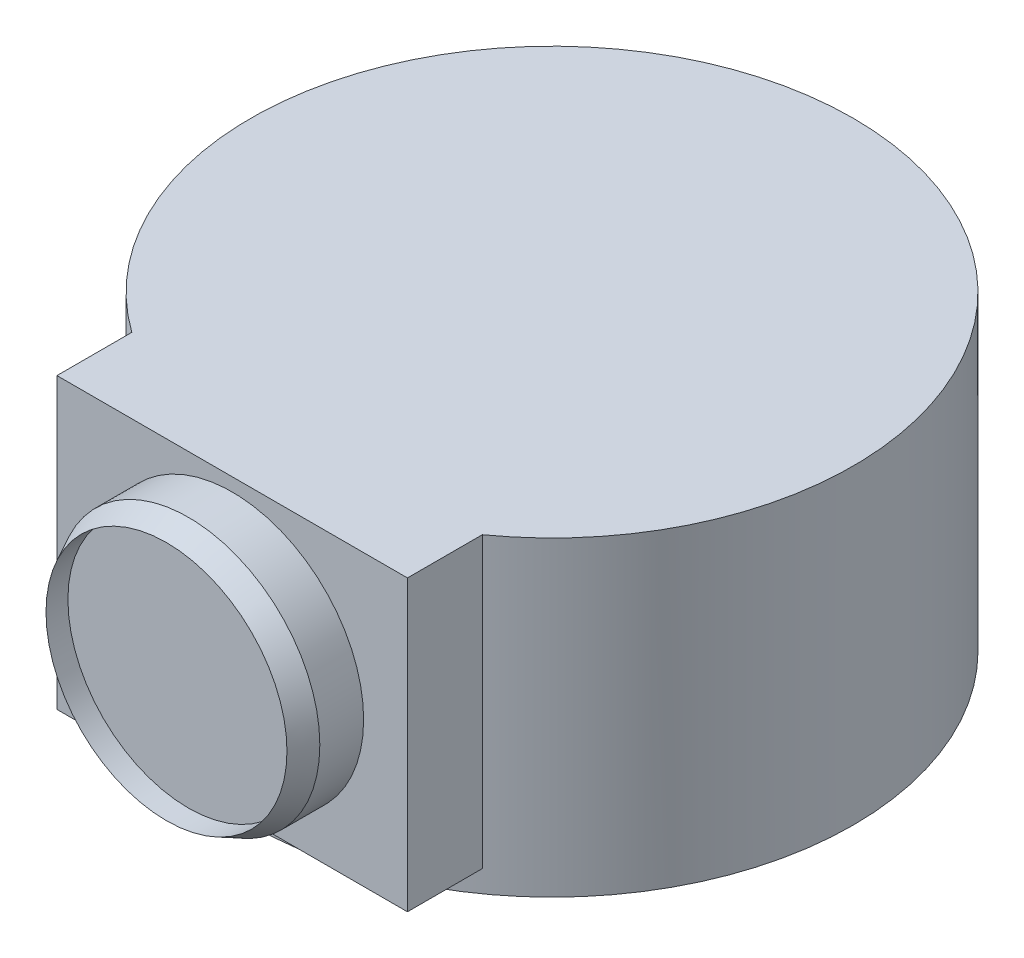
ISO-10303-21;
HEADER;
FILE_DESCRIPTION(('STEP AP214'),'2;1');
FILE_NAME('part.step','',(''),(''),'','','');
FILE_SCHEMA(('AUTOMOTIVE_DESIGN { 1 0 10303 214 1 1 1 1 }'));
ENDSEC;
DATA;
#1=APPLICATION_CONTEXT('core data for automotive mechanical design processes');
#2=APPLICATION_PROTOCOL_DEFINITION('international standard','automotive_design',2000,#1);
#3=PRODUCT_CONTEXT('',#1,'mechanical');
#4=PRODUCT('Part','Part','',(#3));
#5=PRODUCT_RELATED_PRODUCT_CATEGORY('part','',(#4));
#6=PRODUCT_DEFINITION_FORMATION('','',#4);
#7=PRODUCT_DEFINITION_CONTEXT('part definition',#1,'design');
#8=PRODUCT_DEFINITION('design','',#6,#7);
#9=PRODUCT_DEFINITION_SHAPE('','',#8);
#10=(LENGTH_UNIT() NAMED_UNIT(*) SI_UNIT(.MILLI.,.METRE.));
#11=(NAMED_UNIT(*) PLANE_ANGLE_UNIT() SI_UNIT($,.RADIAN.));
#12=(NAMED_UNIT(*) SI_UNIT($,.STERADIAN.) SOLID_ANGLE_UNIT());
#13=UNCERTAINTY_MEASURE_WITH_UNIT(LENGTH_MEASURE(1.E-05),#10,'distance_accuracy_value','');
#14=(GEOMETRIC_REPRESENTATION_CONTEXT(3) GLOBAL_UNCERTAINTY_ASSIGNED_CONTEXT((#13)) GLOBAL_UNIT_ASSIGNED_CONTEXT((#10,
#11,#12)) REPRESENTATION_CONTEXT('',''));
#15=CARTESIAN_POINT('',(0.,0.,0.));
#16=DIRECTION('',(0.,0.,1.));
#17=DIRECTION('',(1.,0.,0.));
#18=AXIS2_PLACEMENT_3D('',#15,#16,#17);
#19=CARTESIAN_POINT('',(0.,0.,0.));
#20=DIRECTION('',(0.,1.,0.));
#21=DIRECTION('',(0.,0.,1.));
#22=AXIS2_PLACEMENT_3D('',#19,#20,#21);
#23=PLANE('',#22);
#24=CARTESIAN_POINT('',(0.,0.,0.));
#25=DIRECTION('',(0.,-1.,0.));
#26=DIRECTION('',(0.,0.,-1.));
#27=AXIS2_PLACEMENT_3D('',#24,#25,#26);
#28=CIRCLE('',#27,68.75);
#29=CARTESIAN_POINT('',(40.,0.,55.9156731158626));
#30=VERTEX_POINT('',#29);
#31=CARTESIAN_POINT('',(-40.,0.,55.9156731158626));
#32=VERTEX_POINT('',#31);
#33=EDGE_CURVE('E83',#30,#32,#28,.T.);
#34=ORIENTED_EDGE('',*,*,#33,.F.);
#35=DIRECTION('',(0.,0.,-1.));
#36=VECTOR('',#35,1.);
#37=CARTESIAN_POINT('',(40.,0.,83.));
#38=LINE('',#37,#36);
#39=CARTESIAN_POINT('',(40.,0.,73.));
#40=VERTEX_POINT('',#39);
#41=EDGE_CURVE('E86',#40,#30,#38,.T.);
#42=ORIENTED_EDGE('',*,*,#41,.F.);
#43=DIRECTION('',(1.,0.,0.));
#44=VECTOR('',#43,1.);
#45=CARTESIAN_POINT('',(0.,0.,73.));
#46=LINE('',#45,#44);
#47=CARTESIAN_POINT('',(-40.,0.,73.));
#48=VERTEX_POINT('',#47);
#49=EDGE_CURVE('E164',#48,#40,#46,.T.);
#50=ORIENTED_EDGE('',*,*,#49,.F.);
#51=DIRECTION('',(0.,0.,-1.));
#52=VECTOR('',#51,1.);
#53=CARTESIAN_POINT('',(-40.,0.,83.));
#54=LINE('',#53,#52);
#55=EDGE_CURVE('E88',#48,#32,#54,.T.);
#56=ORIENTED_EDGE('',*,*,#55,.T.);
#57=EDGE_LOOP('',(#34,#42,#50,#56));
#58=FACE_BOUND('',#57,.T.);
#59=ADVANCED_FACE('F41',(#58),#23,.F.);
#60=CARTESIAN_POINT('',(0.,33.,83.));
#61=DIRECTION('',(0.,0.,1.));
#62=DIRECTION('',(1.,0.,0.));
#63=AXIS2_PLACEMENT_3D('',#60,#61,#62);
#64=CYLINDRICAL_SURFACE('',#63,27.5);
#65=CARTESIAN_POINT('',(0.,33.,88.));
#66=DIRECTION('',(0.,0.,1.));
#67=DIRECTION('',(1.,0.,0.));
#68=AXIS2_PLACEMENT_3D('',#65,#66,#67);
#69=CIRCLE('',#68,27.5);
#70=CARTESIAN_POINT('',(27.5,33.,88.));
#71=VERTEX_POINT('',#70);
#72=EDGE_CURVE('E153',#71,#71,#69,.T.);
#73=ORIENTED_EDGE('',*,*,#72,.T.);
#74=EDGE_LOOP('',(#73));
#75=FACE_BOUND('',#74,.T.);
#76=CARTESIAN_POINT('',(0.,33.,83.));
#77=DIRECTION('',(0.,0.,1.));
#78=DIRECTION('',(1.,0.,0.));
#79=AXIS2_PLACEMENT_3D('',#76,#77,#78);
#80=CIRCLE('',#79,27.5);
#81=CARTESIAN_POINT('',(27.5,33.,83.));
#82=VERTEX_POINT('',#81);
#83=EDGE_CURVE('E50',#82,#82,#80,.F.);
#84=ORIENTED_EDGE('',*,*,#83,.T.);
#85=EDGE_LOOP('',(#84));
#86=FACE_BOUND('',#85,.T.);
#87=ADVANCED_FACE('F119',(#75,#86),#64,.F.);
#88=CARTESIAN_POINT('',(0.,33.,83.));
#89=DIRECTION('',(0.,0.,-1.));
#90=DIRECTION('',(-1.,0.,0.));
#91=AXIS2_PLACEMENT_3D('',#88,#89,#90);
#92=CONICAL_SURFACE('',#91,30.,0.463647609000806);
#93=ORIENTED_EDGE('',*,*,#72,.F.);
#94=EDGE_LOOP('',(#93));
#95=FACE_BOUND('',#94,.T.);
#96=CARTESIAN_POINT('',(0.,33.,83.));
#97=DIRECTION('',(0.,0.,1.));
#98=DIRECTION('',(1.,0.,0.));
#99=AXIS2_PLACEMENT_3D('',#96,#97,#98);
#100=CIRCLE('',#99,30.);
#101=CARTESIAN_POINT('',(30.,33.,83.));
#102=VERTEX_POINT('',#101);
#103=EDGE_CURVE('E171',#102,#102,#100,.T.);
#104=ORIENTED_EDGE('',*,*,#103,.T.);
#105=EDGE_LOOP('',(#104));
#106=FACE_BOUND('',#105,.T.);
#107=ADVANCED_FACE('F124',(#95,#106),#92,.T.);
#108=CARTESIAN_POINT('',(0.,0.,83.));
#109=DIRECTION('',(0.,0.,1.));
#110=DIRECTION('',(1.,0.,0.));
#111=AXIS2_PLACEMENT_3D('',#108,#109,#110);
#112=PLANE('',#111);
#113=ORIENTED_EDGE('',*,*,#83,.F.);
#114=EDGE_LOOP('',(#113));
#115=FACE_BOUND('',#114,.T.);
#116=ADVANCED_FACE('F121',(#115),#112,.T.);
#117=CARTESIAN_POINT('',(0.,33.,73.));
#118=DIRECTION('',(0.,0.,1.));
#119=DIRECTION('',(1.,0.,0.));
#120=AXIS2_PLACEMENT_3D('',#117,#118,#119);
#121=PLANE('',#120);
#122=DIRECTION('',(1.,0.,0.));
#123=VECTOR('',#122,1.);
#124=CARTESIAN_POINT('',(0.,66.,73.));
#125=LINE('',#124,#123);
#126=CARTESIAN_POINT('',(-40.,66.,73.));
#127=VERTEX_POINT('',#126);
#128=CARTESIAN_POINT('',(40.,66.,73.));
#129=VERTEX_POINT('',#128);
#130=EDGE_CURVE('E57',#127,#129,#125,.T.);
#131=ORIENTED_EDGE('',*,*,#130,.F.);
#132=DIRECTION('',(0.,1.,0.));
#133=VECTOR('',#132,1.);
#134=CARTESIAN_POINT('',(-40.,0.,73.));
#135=LINE('',#134,#133);
#136=EDGE_CURVE('E11',#48,#127,#135,.T.);
#137=ORIENTED_EDGE('',*,*,#136,.F.);
#138=ORIENTED_EDGE('',*,*,#49,.T.);
#139=DIRECTION('',(0.,-1.,0.));
#140=VECTOR('',#139,1.);
#141=CARTESIAN_POINT('',(40.,0.,73.));
#142=LINE('',#141,#140);
#143=EDGE_CURVE('E101',#129,#40,#142,.T.);
#144=ORIENTED_EDGE('',*,*,#143,.F.);
#145=EDGE_LOOP('',(#131,#137,#138,#144));
#146=FACE_BOUND('',#145,.T.);
#147=CARTESIAN_POINT('',(0.,33.,73.));
#148=DIRECTION('',(0.,0.,1.));
#149=DIRECTION('',(1.,0.,0.));
#150=AXIS2_PLACEMENT_3D('',#147,#148,#149);
#151=CIRCLE('',#150,30.);
#152=CARTESIAN_POINT('',(30.,33.,73.));
#153=VERTEX_POINT('',#152);
#154=EDGE_CURVE('E168',#153,#153,#151,.T.);
#155=ORIENTED_EDGE('',*,*,#154,.F.);
#156=EDGE_LOOP('',(#155));
#157=FACE_BOUND('',#156,.T.);
#158=ADVANCED_FACE('F123',(#146,#157),#121,.T.);
#159=CARTESIAN_POINT('',(0.,33.,73.));
#160=DIRECTION('',(0.,0.,1.));
#161=DIRECTION('',(1.,0.,0.));
#162=AXIS2_PLACEMENT_3D('',#159,#160,#161);
#163=CYLINDRICAL_SURFACE('',#162,30.);
#164=ORIENTED_EDGE('',*,*,#154,.T.);
#165=EDGE_LOOP('',(#164));
#166=FACE_BOUND('',#165,.T.);
#167=ORIENTED_EDGE('',*,*,#103,.F.);
#168=EDGE_LOOP('',(#167));
#169=FACE_BOUND('',#168,.T.);
#170=ADVANCED_FACE('F130',(#166,#169),#163,.T.);
#171=CARTESIAN_POINT('',(0.,66.,0.));
#172=DIRECTION('',(0.,-1.,0.));
#173=DIRECTION('',(0.,0.,-1.));
#174=AXIS2_PLACEMENT_3D('',#171,#172,#173);
#175=CYLINDRICAL_SURFACE('',#174,68.75);
#176=CARTESIAN_POINT('',(0.,66.,0.));
#177=DIRECTION('',(0.,1.,0.));
#178=DIRECTION('',(0.,0.,1.));
#179=AXIS2_PLACEMENT_3D('',#176,#177,#178);
#180=CIRCLE('',#179,68.75);
#181=CARTESIAN_POINT('',(40.,66.,55.9156731158626));
#182=VERTEX_POINT('',#181);
#183=CARTESIAN_POINT('',(-40.,66.,55.9156731158626));
#184=VERTEX_POINT('',#183);
#185=EDGE_CURVE('E108',#182,#184,#180,.T.);
#186=ORIENTED_EDGE('',*,*,#185,.F.);
#187=DIRECTION('',(0.,-1.,0.));
#188=VECTOR('',#187,1.);
#189=CARTESIAN_POINT('',(40.,66.,55.9156731158626));
#190=LINE('',#189,#188);
#191=EDGE_CURVE('E99',#182,#30,#190,.T.);
#192=ORIENTED_EDGE('',*,*,#191,.T.);
#193=ORIENTED_EDGE('',*,*,#33,.T.);
#194=DIRECTION('',(0.,-1.,0.));
#195=VECTOR('',#194,1.);
#196=CARTESIAN_POINT('',(-40.,66.,55.9156731158626));
#197=LINE('',#196,#195);
#198=EDGE_CURVE('E103',#32,#184,#197,.F.);
#199=ORIENTED_EDGE('',*,*,#198,.T.);
#200=EDGE_LOOP('',(#186,#192,#193,#199));
#201=FACE_BOUND('',#200,.T.);
#202=CARTESIAN_POINT('',(0.,-5.,0.));
#203=DIRECTION('',(0.,-1.,0.));
#204=DIRECTION('',(0.,0.,-1.));
#205=AXIS2_PLACEMENT_3D('',#202,#203,#204);
#206=CIRCLE('',#205,68.75);
#207=CARTESIAN_POINT('',(0.,-5.,-68.75));
#208=VERTEX_POINT('',#207);
#209=EDGE_CURVE('E92',#208,#208,#206,.T.);
#210=ORIENTED_EDGE('',*,*,#209,.F.);
#211=EDGE_LOOP('',(#210));
#212=FACE_BOUND('',#211,.T.);
#213=ADVANCED_FACE('F43',(#201,#212),#175,.T.);
#214=CARTESIAN_POINT('',(40.,0.,83.));
#215=DIRECTION('',(1.,0.,0.));
#216=DIRECTION('',(0.,1.,0.));
#217=AXIS2_PLACEMENT_3D('',#214,#215,#216);
#218=PLANE('',#217);
#219=DIRECTION('',(0.,0.,-1.));
#220=VECTOR('',#219,1.);
#221=CARTESIAN_POINT('',(40.,66.,83.));
#222=LINE('',#221,#220);
#223=EDGE_CURVE('E104',#129,#182,#222,.T.);
#224=ORIENTED_EDGE('',*,*,#223,.F.);
#225=ORIENTED_EDGE('',*,*,#143,.T.);
#226=ORIENTED_EDGE('',*,*,#41,.T.);
#227=ORIENTED_EDGE('',*,*,#191,.F.);
#228=EDGE_LOOP('',(#224,#225,#226,#227));
#229=FACE_BOUND('',#228,.T.);
#230=ADVANCED_FACE('F98',(#229),#218,.T.);
#231=CARTESIAN_POINT('',(-40.,0.,83.));
#232=DIRECTION('',(-1.,0.,0.));
#233=DIRECTION('',(0.,0.,1.));
#234=AXIS2_PLACEMENT_3D('',#231,#232,#233);
#235=PLANE('',#234);
#236=ORIENTED_EDGE('',*,*,#55,.F.);
#237=ORIENTED_EDGE('',*,*,#136,.T.);
#238=DIRECTION('',(0.,0.,-1.));
#239=VECTOR('',#238,1.);
#240=CARTESIAN_POINT('',(-40.,66.,83.));
#241=LINE('',#240,#239);
#242=EDGE_CURVE('E63',#127,#184,#241,.T.);
#243=ORIENTED_EDGE('',*,*,#242,.T.);
#244=ORIENTED_EDGE('',*,*,#198,.F.);
#245=EDGE_LOOP('',(#236,#237,#243,#244));
#246=FACE_BOUND('',#245,.T.);
#247=ADVANCED_FACE('F146',(#246),#235,.T.);
#248=CARTESIAN_POINT('',(0.,66.,0.));
#249=DIRECTION('',(0.,1.,0.));
#250=DIRECTION('',(0.,0.,1.));
#251=AXIS2_PLACEMENT_3D('',#248,#249,#250);
#252=PLANE('',#251);
#253=ORIENTED_EDGE('',*,*,#242,.F.);
#254=ORIENTED_EDGE('',*,*,#130,.T.);
#255=ORIENTED_EDGE('',*,*,#223,.T.);
#256=ORIENTED_EDGE('',*,*,#185,.T.);
#257=EDGE_LOOP('',(#253,#254,#255,#256));
#258=FACE_BOUND('',#257,.T.);
#259=ADVANCED_FACE('F142',(#258),#252,.T.);
#260=CARTESIAN_POINT('',(0.,-5.,0.));
#261=DIRECTION('',(0.,-1.,0.));
#262=DIRECTION('',(0.,0.,-1.));
#263=AXIS2_PLACEMENT_3D('',#260,#261,#262);
#264=PLANE('',#263);
#265=ORIENTED_EDGE('',*,*,#209,.T.);
#266=EDGE_LOOP('',(#265));
#267=FACE_BOUND('',#266,.T.);
#268=ADVANCED_FACE('F145',(#267),#264,.T.);
#269=CLOSED_SHELL('',(#59,#87,#107,#116,#158,#170,#213,#230,#247,#259,#268));
#270=MANIFOLD_SOLID_BREP('B2',#269);
#271=ADVANCED_BREP_SHAPE_REPRESENTATION('',(#18,#270),#14);
#272=SHAPE_DEFINITION_REPRESENTATION(#9,#271);
ENDSEC;
END-ISO-10303-21;
